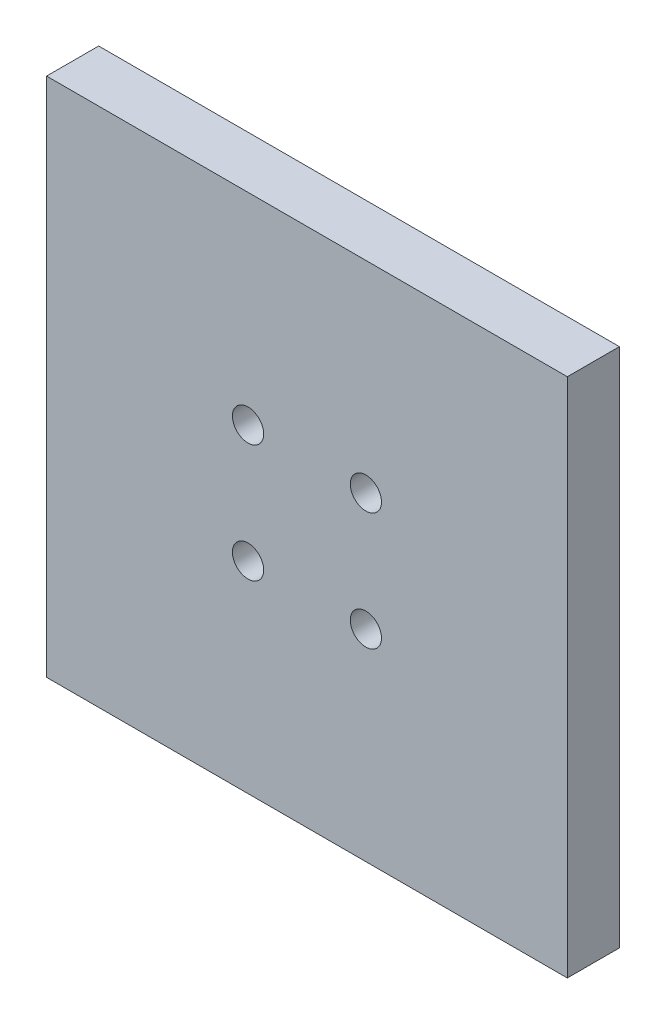
ISO-10303-21;
HEADER;
FILE_DESCRIPTION(('STEP AP214'),'2;1');
FILE_NAME('part.step','',(''),(''),'','','');
FILE_SCHEMA(('AUTOMOTIVE_DESIGN { 1 0 10303 214 1 1 1 1 }'));
ENDSEC;
DATA;
#1=APPLICATION_CONTEXT('core data for automotive mechanical design processes');
#2=APPLICATION_PROTOCOL_DEFINITION('international standard','automotive_design',2000,#1);
#3=PRODUCT_CONTEXT('',#1,'mechanical');
#4=PRODUCT('Part','Part','',(#3));
#5=PRODUCT_RELATED_PRODUCT_CATEGORY('part','',(#4));
#6=PRODUCT_DEFINITION_FORMATION('','',#4);
#7=PRODUCT_DEFINITION_CONTEXT('part definition',#1,'design');
#8=PRODUCT_DEFINITION('design','',#6,#7);
#9=PRODUCT_DEFINITION_SHAPE('','',#8);
#10=(LENGTH_UNIT() NAMED_UNIT(*) SI_UNIT(.MILLI.,.METRE.));
#11=(NAMED_UNIT(*) PLANE_ANGLE_UNIT() SI_UNIT($,.RADIAN.));
#12=(NAMED_UNIT(*) SI_UNIT($,.STERADIAN.) SOLID_ANGLE_UNIT());
#13=UNCERTAINTY_MEASURE_WITH_UNIT(LENGTH_MEASURE(1.E-05),#10,'distance_accuracy_value','');
#14=(GEOMETRIC_REPRESENTATION_CONTEXT(3) GLOBAL_UNCERTAINTY_ASSIGNED_CONTEXT((#13)) GLOBAL_UNIT_ASSIGNED_CONTEXT((#10,
#11,#12)) REPRESENTATION_CONTEXT('',''));
#15=CARTESIAN_POINT('',(0.,0.,0.));
#16=DIRECTION('',(0.,0.,1.));
#17=DIRECTION('',(1.,0.,0.));
#18=AXIS2_PLACEMENT_3D('',#15,#16,#17);
#19=CARTESIAN_POINT('',(-25.,25.,5.));
#20=DIRECTION('',(1.,0.,0.));
#21=DIRECTION('',(0.,1.,0.));
#22=AXIS2_PLACEMENT_3D('',#19,#20,#21);
#23=PLANE('',#22);
#24=DIRECTION('',(0.,-1.,0.));
#25=VECTOR('',#24,1.);
#26=CARTESIAN_POINT('',(-25.,25.,0.));
#27=LINE('',#26,#25);
#28=CARTESIAN_POINT('',(-25.,25.,0.));
#29=VERTEX_POINT('',#28);
#30=CARTESIAN_POINT('',(-25.,-25.,0.));
#31=VERTEX_POINT('',#30);
#32=EDGE_CURVE('E107',#29,#31,#27,.T.);
#33=ORIENTED_EDGE('',*,*,#32,.T.);
#34=DIRECTION('',(0.,0.,-1.));
#35=VECTOR('',#34,1.);
#36=CARTESIAN_POINT('',(-25.,-25.,5.));
#37=LINE('',#36,#35);
#38=CARTESIAN_POINT('',(-25.,-25.,5.));
#39=VERTEX_POINT('',#38);
#40=EDGE_CURVE('E11',#39,#31,#37,.T.);
#41=ORIENTED_EDGE('',*,*,#40,.F.);
#42=DIRECTION('',(0.,-1.,0.));
#43=VECTOR('',#42,1.);
#44=CARTESIAN_POINT('',(-25.,25.,5.));
#45=LINE('',#44,#43);
#46=CARTESIAN_POINT('',(-25.,25.,5.));
#47=VERTEX_POINT('',#46);
#48=EDGE_CURVE('E91',#47,#39,#45,.T.);
#49=ORIENTED_EDGE('',*,*,#48,.F.);
#50=DIRECTION('',(0.,0.,-1.));
#51=VECTOR('',#50,1.);
#52=CARTESIAN_POINT('',(-25.,25.,5.));
#53=LINE('',#52,#51);
#54=EDGE_CURVE('E103',#47,#29,#53,.T.);
#55=ORIENTED_EDGE('',*,*,#54,.T.);
#56=EDGE_LOOP('',(#33,#41,#49,#55));
#57=FACE_BOUND('',#56,.T.);
#58=ADVANCED_FACE('F39',(#57),#23,.F.);
#59=CARTESIAN_POINT('',(-25.,-25.,5.));
#60=DIRECTION('',(0.,1.,0.));
#61=DIRECTION('',(-1.,0.,0.));
#62=AXIS2_PLACEMENT_3D('',#59,#60,#61);
#63=PLANE('',#62);
#64=DIRECTION('',(1.,0.,0.));
#65=VECTOR('',#64,1.);
#66=CARTESIAN_POINT('',(-25.,-25.,0.));
#67=LINE('',#66,#65);
#68=CARTESIAN_POINT('',(25.,-25.,0.));
#69=VERTEX_POINT('',#68);
#70=EDGE_CURVE('E96',#31,#69,#67,.T.);
#71=ORIENTED_EDGE('',*,*,#70,.T.);
#72=DIRECTION('',(0.,0.,-1.));
#73=VECTOR('',#72,1.);
#74=CARTESIAN_POINT('',(25.,-25.,5.));
#75=LINE('',#74,#73);
#76=CARTESIAN_POINT('',(25.,-25.,5.));
#77=VERTEX_POINT('',#76);
#78=EDGE_CURVE('E48',#77,#69,#75,.T.);
#79=ORIENTED_EDGE('',*,*,#78,.F.);
#80=DIRECTION('',(1.,0.,0.));
#81=VECTOR('',#80,1.);
#82=CARTESIAN_POINT('',(-25.,-25.,5.));
#83=LINE('',#82,#81);
#84=EDGE_CURVE('E86',#39,#77,#83,.T.);
#85=ORIENTED_EDGE('',*,*,#84,.F.);
#86=ORIENTED_EDGE('',*,*,#40,.T.);
#87=EDGE_LOOP('',(#71,#79,#85,#86));
#88=FACE_BOUND('',#87,.T.);
#89=ADVANCED_FACE('F95',(#88),#63,.F.);
#90=CARTESIAN_POINT('',(25.,25.,5.));
#91=DIRECTION('',(-1.,0.,0.));
#92=DIRECTION('',(0.,0.,1.));
#93=AXIS2_PLACEMENT_3D('',#90,#91,#92);
#94=PLANE('',#93);
#95=DIRECTION('',(0.,1.,0.));
#96=VECTOR('',#95,1.);
#97=CARTESIAN_POINT('',(25.,25.,0.));
#98=LINE('',#97,#96);
#99=CARTESIAN_POINT('',(25.,25.,0.));
#100=VERTEX_POINT('',#99);
#101=EDGE_CURVE('E73',#69,#100,#98,.T.);
#102=ORIENTED_EDGE('',*,*,#101,.T.);
#103=DIRECTION('',(0.,0.,-1.));
#104=VECTOR('',#103,1.);
#105=CARTESIAN_POINT('',(25.,25.,5.));
#106=LINE('',#105,#104);
#107=CARTESIAN_POINT('',(25.,25.,5.));
#108=VERTEX_POINT('',#107);
#109=EDGE_CURVE('E98',#108,#100,#106,.T.);
#110=ORIENTED_EDGE('',*,*,#109,.F.);
#111=DIRECTION('',(0.,1.,0.));
#112=VECTOR('',#111,1.);
#113=CARTESIAN_POINT('',(25.,25.,5.));
#114=LINE('',#113,#112);
#115=EDGE_CURVE('E89',#77,#108,#114,.T.);
#116=ORIENTED_EDGE('',*,*,#115,.F.);
#117=ORIENTED_EDGE('',*,*,#78,.T.);
#118=EDGE_LOOP('',(#102,#110,#116,#117));
#119=FACE_BOUND('',#118,.T.);
#120=ADVANCED_FACE('F99',(#119),#94,.F.);
#121=CARTESIAN_POINT('',(-25.,25.,5.));
#122=DIRECTION('',(0.,-1.,0.));
#123=DIRECTION('',(1.,0.,0.));
#124=AXIS2_PLACEMENT_3D('',#121,#122,#123);
#125=PLANE('',#124);
#126=DIRECTION('',(-1.,0.,0.));
#127=VECTOR('',#126,1.);
#128=CARTESIAN_POINT('',(-25.,25.,0.));
#129=LINE('',#128,#127);
#130=EDGE_CURVE('E79',#100,#29,#129,.T.);
#131=ORIENTED_EDGE('',*,*,#130,.T.);
#132=ORIENTED_EDGE('',*,*,#54,.F.);
#133=DIRECTION('',(-1.,0.,0.));
#134=VECTOR('',#133,1.);
#135=CARTESIAN_POINT('',(-25.,25.,5.));
#136=LINE('',#135,#134);
#137=EDGE_CURVE('E56',#108,#47,#136,.T.);
#138=ORIENTED_EDGE('',*,*,#137,.F.);
#139=ORIENTED_EDGE('',*,*,#109,.T.);
#140=EDGE_LOOP('',(#131,#132,#138,#139));
#141=FACE_BOUND('',#140,.T.);
#142=ADVANCED_FACE('F121',(#141),#125,.F.);
#143=CARTESIAN_POINT('',(0.,0.,5.));
#144=DIRECTION('',(0.,0.,1.));
#145=DIRECTION('',(1.,0.,0.));
#146=AXIS2_PLACEMENT_3D('',#143,#144,#145);
#147=PLANE('',#146);
#148=CARTESIAN_POINT('',(-5.65685424949235,5.6568542494921,5.));
#149=DIRECTION('',(0.,0.,1.));
#150=DIRECTION('',(1.,0.,0.));
#151=AXIS2_PLACEMENT_3D('',#148,#149,#150);
#152=CIRCLE('',#151,1.50000000000034);
#153=CARTESIAN_POINT('',(-4.15685424949202,5.6568542494921,5.));
#154=VERTEX_POINT('',#153);
#155=EDGE_CURVE('E141',#154,#154,#152,.T.);
#156=ORIENTED_EDGE('',*,*,#155,.F.);
#157=EDGE_LOOP('',(#156));
#158=FACE_BOUND('',#157,.T.);
#159=CARTESIAN_POINT('',(-5.6568542494921,-5.65685424949266,5.));
#160=DIRECTION('',(0.,0.,1.));
#161=DIRECTION('',(1.,0.,0.));
#162=AXIS2_PLACEMENT_3D('',#159,#160,#161);
#163=CIRCLE('',#162,1.50000000000023);
#164=CARTESIAN_POINT('',(-4.15685424949187,-5.65685424949266,5.));
#165=VERTEX_POINT('',#164);
#166=EDGE_CURVE('E140',#165,#165,#163,.T.);
#167=ORIENTED_EDGE('',*,*,#166,.F.);
#168=EDGE_LOOP('',(#167));
#169=FACE_BOUND('',#168,.T.);
#170=CARTESIAN_POINT('',(5.65685424949266,-5.65685424949241,5.));
#171=DIRECTION('',(0.,0.,1.));
#172=DIRECTION('',(1.,0.,0.));
#173=AXIS2_PLACEMENT_3D('',#170,#171,#172);
#174=CIRCLE('',#173,1.49999999999992);
#175=CARTESIAN_POINT('',(7.15685424949258,-5.65685424949241,5.));
#176=VERTEX_POINT('',#175);
#177=EDGE_CURVE('E149',#176,#176,#174,.T.);
#178=ORIENTED_EDGE('',*,*,#177,.F.);
#179=EDGE_LOOP('',(#178));
#180=FACE_BOUND('',#179,.T.);
#181=CARTESIAN_POINT('',(5.65685424949241,5.65685424949235,5.));
#182=DIRECTION('',(0.,0.,1.));
#183=DIRECTION('',(1.,0.,0.));
#184=AXIS2_PLACEMENT_3D('',#181,#182,#183);
#185=CIRCLE('',#184,1.5);
#186=CARTESIAN_POINT('',(7.15685424949241,5.65685424949235,5.));
#187=VERTEX_POINT('',#186);
#188=EDGE_CURVE('E131',#187,#187,#185,.T.);
#189=ORIENTED_EDGE('',*,*,#188,.F.);
#190=EDGE_LOOP('',(#189));
#191=FACE_BOUND('',#190,.T.);
#192=ORIENTED_EDGE('',*,*,#48,.T.);
#193=ORIENTED_EDGE('',*,*,#84,.T.);
#194=ORIENTED_EDGE('',*,*,#115,.T.);
#195=ORIENTED_EDGE('',*,*,#137,.T.);
#196=EDGE_LOOP('',(#192,#193,#194,#195));
#197=FACE_BOUND('',#196,.T.);
#198=ADVANCED_FACE('F87',(#158,#169,#180,#191,#197),#147,.T.);
#199=CARTESIAN_POINT('',(0.,0.,0.));
#200=DIRECTION('',(0.,0.,1.));
#201=DIRECTION('',(1.,0.,0.));
#202=AXIS2_PLACEMENT_3D('',#199,#200,#201);
#203=PLANE('',#202);
#204=CARTESIAN_POINT('',(-5.65685424949235,5.6568542494921,0.));
#205=DIRECTION('',(0.,0.,1.));
#206=DIRECTION('',(1.,0.,0.));
#207=AXIS2_PLACEMENT_3D('',#204,#205,#206);
#208=CIRCLE('',#207,1.50000000000034);
#209=CARTESIAN_POINT('',(-4.15685424949202,5.6568542494921,0.));
#210=VERTEX_POINT('',#209);
#211=EDGE_CURVE('E136',#210,#210,#208,.F.);
#212=ORIENTED_EDGE('',*,*,#211,.F.);
#213=EDGE_LOOP('',(#212));
#214=FACE_BOUND('',#213,.T.);
#215=CARTESIAN_POINT('',(-5.6568542494921,-5.65685424949266,0.));
#216=DIRECTION('',(0.,0.,1.));
#217=DIRECTION('',(1.,0.,0.));
#218=AXIS2_PLACEMENT_3D('',#215,#216,#217);
#219=CIRCLE('',#218,1.50000000000023);
#220=CARTESIAN_POINT('',(-4.15685424949187,-5.65685424949266,0.));
#221=VERTEX_POINT('',#220);
#222=EDGE_CURVE('E145',#221,#221,#219,.F.);
#223=ORIENTED_EDGE('',*,*,#222,.F.);
#224=EDGE_LOOP('',(#223));
#225=FACE_BOUND('',#224,.T.);
#226=CARTESIAN_POINT('',(5.65685424949266,-5.65685424949241,0.));
#227=DIRECTION('',(0.,0.,1.));
#228=DIRECTION('',(1.,0.,0.));
#229=AXIS2_PLACEMENT_3D('',#226,#227,#228);
#230=CIRCLE('',#229,1.49999999999992);
#231=CARTESIAN_POINT('',(7.15685424949258,-5.65685424949241,0.));
#232=VERTEX_POINT('',#231);
#233=EDGE_CURVE('E135',#232,#232,#230,.F.);
#234=ORIENTED_EDGE('',*,*,#233,.F.);
#235=EDGE_LOOP('',(#234));
#236=FACE_BOUND('',#235,.T.);
#237=CARTESIAN_POINT('',(5.65685424949241,5.65685424949235,0.));
#238=DIRECTION('',(0.,0.,1.));
#239=DIRECTION('',(1.,0.,0.));
#240=AXIS2_PLACEMENT_3D('',#237,#238,#239);
#241=CIRCLE('',#240,1.5);
#242=CARTESIAN_POINT('',(7.15685424949241,5.65685424949235,0.));
#243=VERTEX_POINT('',#242);
#244=EDGE_CURVE('E111',#243,#243,#241,.F.);
#245=ORIENTED_EDGE('',*,*,#244,.F.);
#246=EDGE_LOOP('',(#245));
#247=FACE_BOUND('',#246,.T.);
#248=ORIENTED_EDGE('',*,*,#32,.F.);
#249=ORIENTED_EDGE('',*,*,#130,.F.);
#250=ORIENTED_EDGE('',*,*,#101,.F.);
#251=ORIENTED_EDGE('',*,*,#70,.F.);
#252=EDGE_LOOP('',(#248,#249,#250,#251));
#253=FACE_BOUND('',#252,.T.);
#254=ADVANCED_FACE('F124',(#214,#225,#236,#247,#253),#203,.F.);
#255=CARTESIAN_POINT('',(5.65685424949241,5.65685424949235,-4.24264068712024));
#256=DIRECTION('',(0.,0.,1.));
#257=DIRECTION('',(1.,0.,0.));
#258=AXIS2_PLACEMENT_3D('',#255,#256,#257);
#259=CYLINDRICAL_SURFACE('',#258,1.5);
#260=ORIENTED_EDGE('',*,*,#244,.T.);
#261=EDGE_LOOP('',(#260));
#262=FACE_BOUND('',#261,.T.);
#263=ORIENTED_EDGE('',*,*,#188,.T.);
#264=EDGE_LOOP('',(#263));
#265=FACE_BOUND('',#264,.T.);
#266=ADVANCED_FACE('F168',(#262,#265),#259,.F.);
#267=CARTESIAN_POINT('',(5.65685424949266,-5.65685424949241,-4.24264068712024));
#268=DIRECTION('',(0.,0.,1.));
#269=DIRECTION('',(1.,0.,0.));
#270=AXIS2_PLACEMENT_3D('',#267,#268,#269);
#271=CYLINDRICAL_SURFACE('',#270,1.49999999999992);
#272=ORIENTED_EDGE('',*,*,#233,.T.);
#273=EDGE_LOOP('',(#272));
#274=FACE_BOUND('',#273,.T.);
#275=ORIENTED_EDGE('',*,*,#177,.T.);
#276=EDGE_LOOP('',(#275));
#277=FACE_BOUND('',#276,.T.);
#278=ADVANCED_FACE('F160',(#274,#277),#271,.F.);
#279=CARTESIAN_POINT('',(-5.6568542494921,-5.65685424949266,-4.24264068712024));
#280=DIRECTION('',(0.,0.,1.));
#281=DIRECTION('',(1.,0.,0.));
#282=AXIS2_PLACEMENT_3D('',#279,#280,#281);
#283=CYLINDRICAL_SURFACE('',#282,1.50000000000023);
#284=ORIENTED_EDGE('',*,*,#222,.T.);
#285=EDGE_LOOP('',(#284));
#286=FACE_BOUND('',#285,.T.);
#287=ORIENTED_EDGE('',*,*,#166,.T.);
#288=EDGE_LOOP('',(#287));
#289=FACE_BOUND('',#288,.T.);
#290=ADVANCED_FACE('F176',(#286,#289),#283,.F.);
#291=CARTESIAN_POINT('',(-5.65685424949235,5.6568542494921,-4.24264068712024));
#292=DIRECTION('',(0.,0.,1.));
#293=DIRECTION('',(1.,0.,0.));
#294=AXIS2_PLACEMENT_3D('',#291,#292,#293);
#295=CYLINDRICAL_SURFACE('',#294,1.50000000000034);
#296=ORIENTED_EDGE('',*,*,#211,.T.);
#297=EDGE_LOOP('',(#296));
#298=FACE_BOUND('',#297,.T.);
#299=ORIENTED_EDGE('',*,*,#155,.T.);
#300=EDGE_LOOP('',(#299));
#301=FACE_BOUND('',#300,.T.);
#302=ADVANCED_FACE('F223',(#298,#301),#295,.F.);
#303=CLOSED_SHELL('',(#58,#89,#120,#142,#198,#254,#266,#278,#290,#302));
#304=MANIFOLD_SOLID_BREP('B2',#303);
#305=ADVANCED_BREP_SHAPE_REPRESENTATION('',(#18,#304),#14);
#306=SHAPE_DEFINITION_REPRESENTATION(#9,#305);
ENDSEC;
END-ISO-10303-21;
